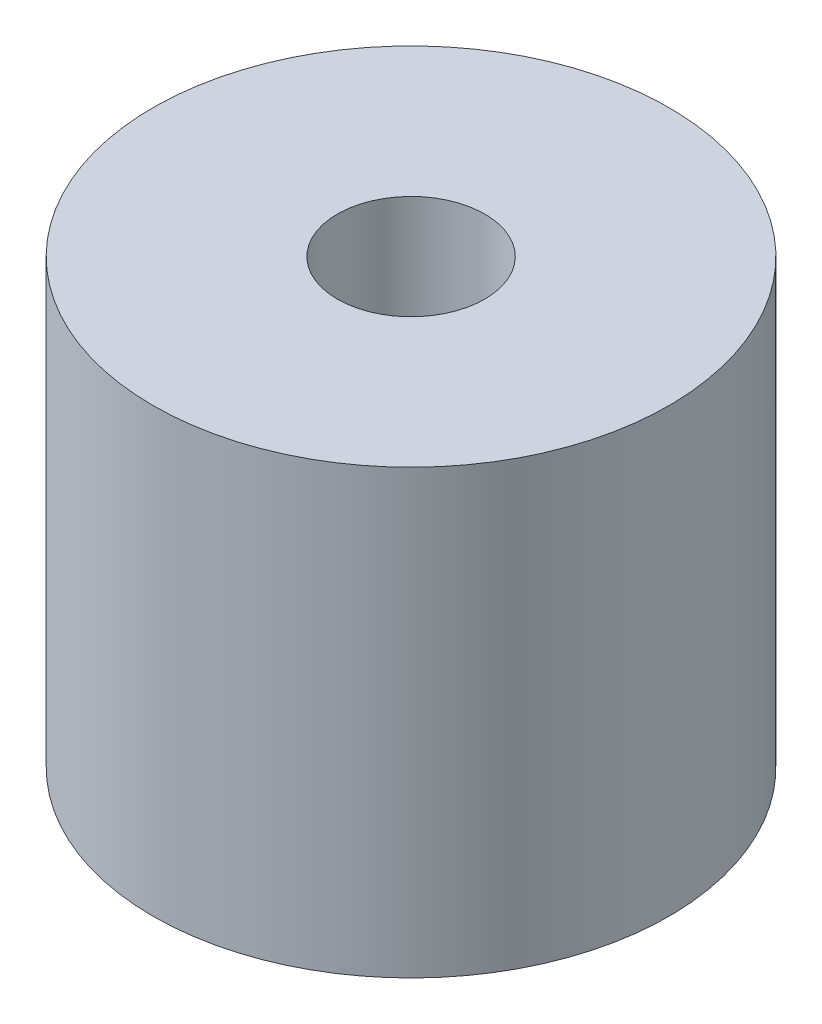
ISO-10303-21;
HEADER;
FILE_DESCRIPTION(('STEP AP214'),'2;1');
FILE_NAME('part.step','',(''),(''),'','','');
FILE_SCHEMA(('AUTOMOTIVE_DESIGN { 1 0 10303 214 1 1 1 1 }'));
ENDSEC;
DATA;
#1=APPLICATION_CONTEXT('core data for automotive mechanical design processes');
#2=APPLICATION_PROTOCOL_DEFINITION('international standard','automotive_design',2000,#1);
#3=PRODUCT_CONTEXT('',#1,'mechanical');
#4=PRODUCT('Part','Part','',(#3));
#5=PRODUCT_RELATED_PRODUCT_CATEGORY('part','',(#4));
#6=PRODUCT_DEFINITION_FORMATION('','',#4);
#7=PRODUCT_DEFINITION_CONTEXT('part definition',#1,'design');
#8=PRODUCT_DEFINITION('design','',#6,#7);
#9=PRODUCT_DEFINITION_SHAPE('','',#8);
#10=(LENGTH_UNIT() NAMED_UNIT(*) SI_UNIT(.MILLI.,.METRE.));
#11=(NAMED_UNIT(*) PLANE_ANGLE_UNIT() SI_UNIT($,.RADIAN.));
#12=(NAMED_UNIT(*) SI_UNIT($,.STERADIAN.) SOLID_ANGLE_UNIT());
#13=UNCERTAINTY_MEASURE_WITH_UNIT(LENGTH_MEASURE(1.E-05),#10,'distance_accuracy_value','');
#14=(GEOMETRIC_REPRESENTATION_CONTEXT(3) GLOBAL_UNCERTAINTY_ASSIGNED_CONTEXT((#13)) GLOBAL_UNIT_ASSIGNED_CONTEXT((#10,
#11,#12)) REPRESENTATION_CONTEXT('',''));
#15=CARTESIAN_POINT('',(0.,0.,0.));
#16=DIRECTION('',(0.,0.,1.));
#17=DIRECTION('',(1.,0.,0.));
#18=AXIS2_PLACEMENT_3D('',#15,#16,#17);
#19=CARTESIAN_POINT('',(0.,25.,0.));
#20=DIRECTION('',(0.,-1.,0.));
#21=DIRECTION('',(0.,0.,-1.));
#22=AXIS2_PLACEMENT_3D('',#19,#20,#21);
#23=CYLINDRICAL_SURFACE('',#22,17.);
#24=CARTESIAN_POINT('',(0.,0.,0.));
#25=DIRECTION('',(0.,1.,0.));
#26=DIRECTION('',(0.,0.,1.));
#27=AXIS2_PLACEMENT_3D('',#24,#25,#26);
#28=CIRCLE('',#27,17.);
#29=CARTESIAN_POINT('',(0.,0.,17.));
#30=VERTEX_POINT('',#29);
#31=EDGE_CURVE('E52',#30,#30,#28,.T.);
#32=ORIENTED_EDGE('',*,*,#31,.F.);
#33=EDGE_LOOP('',(#32));
#34=FACE_BOUND('',#33,.T.);
#35=CARTESIAN_POINT('',(0.,20.,0.));
#36=DIRECTION('',(0.,1.,0.));
#37=DIRECTION('',(0.,0.,1.));
#38=AXIS2_PLACEMENT_3D('',#35,#36,#37);
#39=CIRCLE('',#38,17.);
#40=CARTESIAN_POINT('',(0.,20.,17.));
#41=VERTEX_POINT('',#40);
#42=EDGE_CURVE('E48',#41,#41,#39,.T.);
#43=ORIENTED_EDGE('',*,*,#42,.T.);
#44=EDGE_LOOP('',(#43));
#45=FACE_BOUND('',#44,.T.);
#46=ADVANCED_FACE('F44',(#34,#45),#23,.F.);
#47=CARTESIAN_POINT('',(0.,0.,0.));
#48=DIRECTION('',(0.,1.,0.));
#49=DIRECTION('',(0.,0.,1.));
#50=AXIS2_PLACEMENT_3D('',#47,#48,#49);
#51=PLANE('',#50);
#52=CARTESIAN_POINT('',(0.,0.,0.));
#53=DIRECTION('',(0.,1.,0.));
#54=DIRECTION('',(0.,0.,1.));
#55=AXIS2_PLACEMENT_3D('',#52,#53,#54);
#56=CIRCLE('',#55,17.5);
#57=CARTESIAN_POINT('',(0.,0.,17.5));
#58=VERTEX_POINT('',#57);
#59=EDGE_CURVE('E12',#58,#58,#56,.T.);
#60=ORIENTED_EDGE('',*,*,#59,.F.);
#61=EDGE_LOOP('',(#60));
#62=FACE_BOUND('',#61,.T.);
#63=ORIENTED_EDGE('',*,*,#31,.T.);
#64=EDGE_LOOP('',(#63));
#65=FACE_BOUND('',#64,.T.);
#66=ADVANCED_FACE('F79',(#62,#65),#51,.F.);
#67=CARTESIAN_POINT('',(0.,25.,0.));
#68=DIRECTION('',(0.,-1.,0.));
#69=DIRECTION('',(0.,0.,-1.));
#70=AXIS2_PLACEMENT_3D('',#67,#68,#69);
#71=CYLINDRICAL_SURFACE('',#70,17.5);
#72=ORIENTED_EDGE('',*,*,#59,.T.);
#73=EDGE_LOOP('',(#72));
#74=FACE_BOUND('',#73,.T.);
#75=CARTESIAN_POINT('',(0.,30.,0.));
#76=DIRECTION('',(0.,1.,0.));
#77=DIRECTION('',(0.,0.,1.));
#78=AXIS2_PLACEMENT_3D('',#75,#76,#77);
#79=CIRCLE('',#78,17.5);
#80=CARTESIAN_POINT('',(0.,30.,17.5));
#81=VERTEX_POINT('',#80);
#82=EDGE_CURVE('E58',#81,#81,#79,.T.);
#83=ORIENTED_EDGE('',*,*,#82,.F.);
#84=EDGE_LOOP('',(#83));
#85=FACE_BOUND('',#84,.T.);
#86=ADVANCED_FACE('F46',(#74,#85),#71,.T.);
#87=CARTESIAN_POINT('',(0.,20.,0.));
#88=DIRECTION('',(0.,1.,0.));
#89=DIRECTION('',(0.,0.,1.));
#90=AXIS2_PLACEMENT_3D('',#87,#88,#89);
#91=PLANE('',#90);
#92=CARTESIAN_POINT('',(0.,20.,0.));
#93=DIRECTION('',(0.,1.,0.));
#94=DIRECTION('',(0.,0.,1.));
#95=AXIS2_PLACEMENT_3D('',#92,#93,#94);
#96=CIRCLE('',#95,5.);
#97=CARTESIAN_POINT('',(0.,20.,5.));
#98=VERTEX_POINT('',#97);
#99=EDGE_CURVE('E61',#98,#98,#96,.T.);
#100=ORIENTED_EDGE('',*,*,#99,.T.);
#101=EDGE_LOOP('',(#100));
#102=FACE_BOUND('',#101,.T.);
#103=ORIENTED_EDGE('',*,*,#42,.F.);
#104=EDGE_LOOP('',(#103));
#105=FACE_BOUND('',#104,.T.);
#106=ADVANCED_FACE('F74',(#102,#105),#91,.F.);
#107=CARTESIAN_POINT('',(0.,30.,0.));
#108=DIRECTION('',(0.,1.,0.));
#109=DIRECTION('',(0.,0.,1.));
#110=AXIS2_PLACEMENT_3D('',#107,#108,#109);
#111=PLANE('',#110);
#112=CARTESIAN_POINT('',(0.,30.,0.));
#113=DIRECTION('',(0.,1.,0.));
#114=DIRECTION('',(0.,0.,1.));
#115=AXIS2_PLACEMENT_3D('',#112,#113,#114);
#116=CIRCLE('',#115,5.);
#117=CARTESIAN_POINT('',(0.,30.,5.));
#118=VERTEX_POINT('',#117);
#119=EDGE_CURVE('E64',#118,#118,#116,.T.);
#120=ORIENTED_EDGE('',*,*,#119,.F.);
#121=EDGE_LOOP('',(#120));
#122=FACE_BOUND('',#121,.T.);
#123=ORIENTED_EDGE('',*,*,#82,.T.);
#124=EDGE_LOOP('',(#123));
#125=FACE_BOUND('',#124,.T.);
#126=ADVANCED_FACE('F71',(#122,#125),#111,.T.);
#127=CARTESIAN_POINT('',(0.,5.,0.));
#128=DIRECTION('',(0.,1.,0.));
#129=DIRECTION('',(0.,0.,1.));
#130=AXIS2_PLACEMENT_3D('',#127,#128,#129);
#131=CYLINDRICAL_SURFACE('',#130,5.);
#132=ORIENTED_EDGE('',*,*,#119,.T.);
#133=EDGE_LOOP('',(#132));
#134=FACE_BOUND('',#133,.T.);
#135=ORIENTED_EDGE('',*,*,#99,.F.);
#136=EDGE_LOOP('',(#135));
#137=FACE_BOUND('',#136,.T.);
#138=ADVANCED_FACE('F68',(#134,#137),#131,.F.);
#139=CLOSED_SHELL('',(#46,#66,#86,#106,#126,#138));
#140=MANIFOLD_SOLID_BREP('B2',#139);
#141=ADVANCED_BREP_SHAPE_REPRESENTATION('',(#18,#140),#14);
#142=SHAPE_DEFINITION_REPRESENTATION(#9,#141);
ENDSEC;
END-ISO-10303-21;
